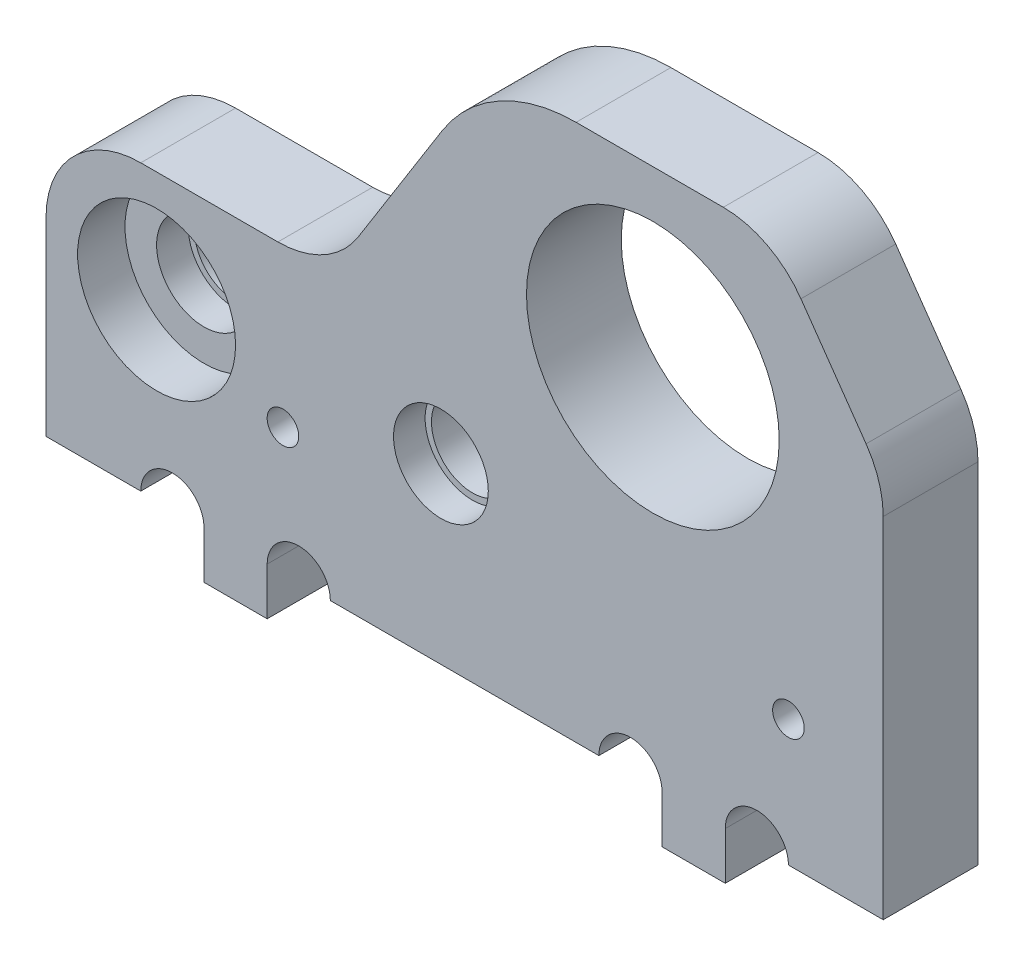
ISO-10303-21;
HEADER;
FILE_DESCRIPTION(('STEP AP214'),'2;1');
FILE_NAME('part.step','',(''),(''),'','','');
FILE_SCHEMA(('AUTOMOTIVE_DESIGN { 1 0 10303 214 1 1 1 1 }'));
ENDSEC;
DATA;
#1=APPLICATION_CONTEXT('core data for automotive mechanical design processes');
#2=APPLICATION_PROTOCOL_DEFINITION('international standard','automotive_design',2000,#1);
#3=PRODUCT_CONTEXT('',#1,'mechanical');
#4=PRODUCT('Part','Part','',(#3));
#5=PRODUCT_RELATED_PRODUCT_CATEGORY('part','',(#4));
#6=PRODUCT_DEFINITION_FORMATION('','',#4);
#7=PRODUCT_DEFINITION_CONTEXT('part definition',#1,'design');
#8=PRODUCT_DEFINITION('design','',#6,#7);
#9=PRODUCT_DEFINITION_SHAPE('','',#8);
#10=(LENGTH_UNIT() NAMED_UNIT(*) SI_UNIT(.MILLI.,.METRE.));
#11=(NAMED_UNIT(*) PLANE_ANGLE_UNIT() SI_UNIT($,.RADIAN.));
#12=(NAMED_UNIT(*) SI_UNIT($,.STERADIAN.) SOLID_ANGLE_UNIT());
#13=UNCERTAINTY_MEASURE_WITH_UNIT(LENGTH_MEASURE(1.E-05),#10,'distance_accuracy_value','');
#14=(GEOMETRIC_REPRESENTATION_CONTEXT(3) GLOBAL_UNCERTAINTY_ASSIGNED_CONTEXT((#13)) GLOBAL_UNIT_ASSIGNED_CONTEXT((#10,
#11,#12)) REPRESENTATION_CONTEXT('',''));
#15=CARTESIAN_POINT('',(0.,0.,0.));
#16=DIRECTION('',(0.,0.,1.));
#17=DIRECTION('',(1.,0.,0.));
#18=AXIS2_PLACEMENT_3D('',#15,#16,#17);
#19=CARTESIAN_POINT('',(0.,0.,0.));
#20=DIRECTION('',(0.,-1.,0.));
#21=DIRECTION('',(0.,0.,-1.));
#22=AXIS2_PLACEMENT_3D('',#19,#20,#21);
#23=PLANE('',#22);
#24=DIRECTION('',(-1.,0.,0.));
#25=VECTOR('',#24,1.);
#26=CARTESIAN_POINT('',(0.,0.,-3.));
#27=LINE('',#26,#25);
#28=CARTESIAN_POINT('',(17.5,0.,-3.));
#29=VERTEX_POINT('',#28);
#30=CARTESIAN_POINT('',(9.,0.,-3.));
#31=VERTEX_POINT('',#30);
#32=EDGE_CURVE('E311',#29,#31,#27,.T.);
#33=ORIENTED_EDGE('',*,*,#32,.F.);
#34=DIRECTION('',(0.,0.,-1.));
#35=VECTOR('',#34,1.);
#36=CARTESIAN_POINT('',(17.5,0.,0.));
#37=LINE('',#36,#35);
#38=CARTESIAN_POINT('',(17.5,0.,0.));
#39=VERTEX_POINT('',#38);
#40=EDGE_CURVE('E355',#39,#29,#37,.T.);
#41=ORIENTED_EDGE('',*,*,#40,.F.);
#42=DIRECTION('',(1.,0.,0.));
#43=VECTOR('',#42,1.);
#44=CARTESIAN_POINT('',(0.,0.,0.));
#45=LINE('',#44,#43);
#46=CARTESIAN_POINT('',(9.,0.,0.));
#47=VERTEX_POINT('',#46);
#48=EDGE_CURVE('E224',#47,#39,#45,.T.);
#49=ORIENTED_EDGE('',*,*,#48,.F.);
#50=DIRECTION('',(0.,0.,-1.));
#51=VECTOR('',#50,1.);
#52=CARTESIAN_POINT('',(9.,0.,0.));
#53=LINE('',#52,#51);
#54=EDGE_CURVE('E358',#31,#47,#53,.F.);
#55=ORIENTED_EDGE('',*,*,#54,.F.);
#56=EDGE_LOOP('',(#33,#41,#49,#55));
#57=FACE_BOUND('',#56,.T.);
#58=ADVANCED_FACE('F33',(#57),#23,.T.);
#59=DIRECTION('',(-1.,0.,0.));
#60=VECTOR('',#59,1.);
#61=CARTESIAN_POINT('',(0.,0.,-3.));
#62=LINE('',#61,#60);
#63=CARTESIAN_POINT('',(26.5,0.,-3.));
#64=VERTEX_POINT('',#63);
#65=CARTESIAN_POINT('',(23.5,0.,-3.));
#66=VERTEX_POINT('',#65);
#67=EDGE_CURVE('E197',#64,#66,#62,.T.);
#68=ORIENTED_EDGE('',*,*,#67,.F.);
#69=DIRECTION('',(0.,0.,-1.));
#70=VECTOR('',#69,1.);
#71=CARTESIAN_POINT('',(26.5,0.,0.));
#72=LINE('',#71,#70);
#73=CARTESIAN_POINT('',(26.5,0.,0.));
#74=VERTEX_POINT('',#73);
#75=EDGE_CURVE('E210',#74,#64,#72,.T.);
#76=ORIENTED_EDGE('',*,*,#75,.F.);
#77=CARTESIAN_POINT('',(23.5,0.,0.));
#78=VERTEX_POINT('',#77);
#79=EDGE_CURVE('E226',#78,#74,#45,.T.);
#80=ORIENTED_EDGE('',*,*,#79,.F.);
#81=DIRECTION('',(0.,0.,-1.));
#82=VECTOR('',#81,1.);
#83=CARTESIAN_POINT('',(23.5,0.,0.));
#84=LINE('',#83,#82);
#85=EDGE_CURVE('E211',#66,#78,#84,.F.);
#86=ORIENTED_EDGE('',*,*,#85,.F.);
#87=EDGE_LOOP('',(#68,#76,#80,#86));
#88=FACE_BOUND('',#87,.T.);
#89=ADVANCED_FACE('F208',(#88),#23,.T.);
#90=DIRECTION('',(-1.,0.,0.));
#91=VECTOR('',#90,1.);
#92=CARTESIAN_POINT('',(0.,0.,-3.));
#93=LINE('',#92,#91);
#94=CARTESIAN_POINT('',(3.,0.,-3.));
#95=VERTEX_POINT('',#94);
#96=CARTESIAN_POINT('',(0.,0.,-3.));
#97=VERTEX_POINT('',#96);
#98=EDGE_CURVE('E303',#95,#97,#93,.T.);
#99=ORIENTED_EDGE('',*,*,#98,.F.);
#100=DIRECTION('',(0.,0.,-1.));
#101=VECTOR('',#100,1.);
#102=CARTESIAN_POINT('',(3.,0.,0.));
#103=LINE('',#102,#101);
#104=CARTESIAN_POINT('',(3.,0.,0.));
#105=VERTEX_POINT('',#104);
#106=EDGE_CURVE('E360',#105,#95,#103,.T.);
#107=ORIENTED_EDGE('',*,*,#106,.F.);
#108=CARTESIAN_POINT('',(0.,0.,0.));
#109=VERTEX_POINT('',#108);
#110=EDGE_CURVE('E220',#109,#105,#45,.T.);
#111=ORIENTED_EDGE('',*,*,#110,.F.);
#112=DIRECTION('',(0.,0.,1.));
#113=VECTOR('',#112,1.);
#114=CARTESIAN_POINT('',(0.,0.,0.));
#115=LINE('',#114,#113);
#116=EDGE_CURVE('E424',#97,#109,#115,.T.);
#117=ORIENTED_EDGE('',*,*,#116,.F.);
#118=EDGE_LOOP('',(#99,#107,#111,#117));
#119=FACE_BOUND('',#118,.T.);
#120=ADVANCED_FACE('F492',(#119),#23,.T.);
#121=CARTESIAN_POINT('',(12.5,5.5,-6.));
#122=DIRECTION('',(0.,0.,1.));
#123=DIRECTION('',(1.,0.,0.));
#124=AXIS2_PLACEMENT_3D('',#121,#122,#123);
#125=CYLINDRICAL_SURFACE('',#124,1.3);
#126=CARTESIAN_POINT('',(12.5,5.5,-3.));
#127=DIRECTION('',(0.,0.,1.));
#128=DIRECTION('',(1.,0.,0.));
#129=AXIS2_PLACEMENT_3D('',#126,#127,#128);
#130=CIRCLE('',#129,1.3);
#131=CARTESIAN_POINT('',(13.8,5.5,-3.));
#132=VERTEX_POINT('',#131);
#133=EDGE_CURVE('E328',#132,#132,#130,.F.);
#134=ORIENTED_EDGE('',*,*,#133,.T.);
#135=EDGE_LOOP('',(#134));
#136=FACE_BOUND('',#135,.T.);
#137=CARTESIAN_POINT('',(12.5,5.5,-1.));
#138=DIRECTION('',(0.,0.,1.));
#139=DIRECTION('',(1.,0.,0.));
#140=AXIS2_PLACEMENT_3D('',#137,#138,#139);
#141=CIRCLE('',#140,1.3);
#142=CARTESIAN_POINT('',(13.8,5.5,-1.));
#143=VERTEX_POINT('',#142);
#144=EDGE_CURVE('E417',#143,#143,#141,.T.);
#145=ORIENTED_EDGE('',*,*,#144,.T.);
#146=EDGE_LOOP('',(#145));
#147=FACE_BOUND('',#146,.T.);
#148=ADVANCED_FACE('F500',(#136,#147),#125,.F.);
#149=CARTESIAN_POINT('',(3.5,5.5,-6.));
#150=DIRECTION('',(0.,0.,1.));
#151=DIRECTION('',(1.,0.,0.));
#152=AXIS2_PLACEMENT_3D('',#149,#150,#151);
#153=CYLINDRICAL_SURFACE('',#152,1.3);
#154=CARTESIAN_POINT('',(3.5,5.5,-3.));
#155=DIRECTION('',(0.,0.,1.));
#156=DIRECTION('',(1.,0.,0.));
#157=AXIS2_PLACEMENT_3D('',#154,#155,#156);
#158=CIRCLE('',#157,1.3);
#159=CARTESIAN_POINT('',(4.8,5.5,-3.));
#160=VERTEX_POINT('',#159);
#161=EDGE_CURVE('E325',#160,#160,#158,.F.);
#162=ORIENTED_EDGE('',*,*,#161,.T.);
#163=EDGE_LOOP('',(#162));
#164=FACE_BOUND('',#163,.T.);
#165=CARTESIAN_POINT('',(3.5,5.5,-2.5));
#166=DIRECTION('',(0.,0.,1.));
#167=DIRECTION('',(1.,0.,0.));
#168=AXIS2_PLACEMENT_3D('',#165,#166,#167);
#169=CIRCLE('',#168,1.3);
#170=CARTESIAN_POINT('',(4.8,5.5,-2.5));
#171=VERTEX_POINT('',#170);
#172=EDGE_CURVE('E399',#171,#171,#169,.T.);
#173=ORIENTED_EDGE('',*,*,#172,.T.);
#174=EDGE_LOOP('',(#173));
#175=FACE_BOUND('',#174,.T.);
#176=ADVANCED_FACE('F505',(#164,#175),#153,.F.);
#177=CARTESIAN_POINT('',(0.,17.,0.));
#178=DIRECTION('',(1.,0.,0.));
#179=DIRECTION('',(0.,0.,-1.));
#180=AXIS2_PLACEMENT_3D('',#177,#178,#179);
#181=PLANE('',#180);
#182=DIRECTION('',(0.,0.,-1.));
#183=VECTOR('',#182,1.);
#184=CARTESIAN_POINT('',(0.,6.,0.));
#185=LINE('',#184,#183);
#186=CARTESIAN_POINT('',(0.,6.,0.));
#187=VERTEX_POINT('',#186);
#188=CARTESIAN_POINT('',(0.,6.,-3.));
#189=VERTEX_POINT('',#188);
#190=EDGE_CURVE('E265',#187,#189,#185,.T.);
#191=ORIENTED_EDGE('',*,*,#190,.T.);
#192=DIRECTION('',(0.,1.,0.));
#193=VECTOR('',#192,1.);
#194=CARTESIAN_POINT('',(0.,-1.5,-3.));
#195=LINE('',#194,#193);
#196=EDGE_CURVE('E49',#97,#189,#195,.T.);
#197=ORIENTED_EDGE('',*,*,#196,.F.);
#198=ORIENTED_EDGE('',*,*,#116,.T.);
#199=DIRECTION('',(0.,-1.,0.));
#200=VECTOR('',#199,1.);
#201=CARTESIAN_POINT('',(0.,17.,0.));
#202=LINE('',#201,#200);
#203=EDGE_CURVE('E230',#187,#109,#202,.T.);
#204=ORIENTED_EDGE('',*,*,#203,.F.);
#205=EDGE_LOOP('',(#191,#197,#198,#204));
#206=FACE_BOUND('',#205,.T.);
#207=ADVANCED_FACE('F271',(#206),#181,.F.);
#208=CARTESIAN_POINT('',(0.,17.,0.));
#209=DIRECTION('',(0.,0.,-1.));
#210=DIRECTION('',(-1.,0.,0.));
#211=AXIS2_PLACEMENT_3D('',#208,#209,#210);
#212=PLANE('',#211);
#213=CARTESIAN_POINT('',(23.5,4.,0.));
#214=DIRECTION('',(0.,0.,-1.));
#215=DIRECTION('',(-1.,0.,0.));
#216=AXIS2_PLACEMENT_3D('',#213,#214,#215);
#217=CIRCLE('',#216,0.499999999999999);
#218=CARTESIAN_POINT('',(23.,4.,0.));
#219=VERTEX_POINT('',#218);
#220=EDGE_CURVE('E332',#219,#219,#217,.T.);
#221=ORIENTED_EDGE('',*,*,#220,.T.);
#222=EDGE_LOOP('',(#221));
#223=FACE_BOUND('',#222,.T.);
#224=CARTESIAN_POINT('',(7.5,4.,0.));
#225=DIRECTION('',(0.,0.,-1.));
#226=DIRECTION('',(-1.,0.,0.));
#227=AXIS2_PLACEMENT_3D('',#224,#225,#226);
#228=CIRCLE('',#227,0.500000000000001);
#229=CARTESIAN_POINT('',(7.,4.,0.));
#230=VERTEX_POINT('',#229);
#231=EDGE_CURVE('E331',#230,#230,#228,.T.);
#232=ORIENTED_EDGE('',*,*,#231,.T.);
#233=EDGE_LOOP('',(#232));
#234=FACE_BOUND('',#233,.T.);
#235=CARTESIAN_POINT('',(3.5,5.5,0.));
#236=DIRECTION('',(0.,0.,1.));
#237=DIRECTION('',(1.,0.,0.));
#238=AXIS2_PLACEMENT_3D('',#235,#236,#237);
#239=CIRCLE('',#238,2.5);
#240=CARTESIAN_POINT('',(6.,5.5,0.));
#241=VERTEX_POINT('',#240);
#242=EDGE_CURVE('E406',#241,#241,#239,.T.);
#243=ORIENTED_EDGE('',*,*,#242,.F.);
#244=EDGE_LOOP('',(#243));
#245=FACE_BOUND('',#244,.T.);
#246=CARTESIAN_POINT('',(19.2082039324994,11.5,0.));
#247=DIRECTION('',(0.,0.,1.));
#248=DIRECTION('',(1.,0.,0.));
#249=AXIS2_PLACEMENT_3D('',#246,#247,#248);
#250=CIRCLE('',#249,4.);
#251=CARTESIAN_POINT('',(23.2082039324994,11.5,0.));
#252=VERTEX_POINT('',#251);
#253=EDGE_CURVE('E412',#252,#252,#250,.T.);
#254=ORIENTED_EDGE('',*,*,#253,.F.);
#255=EDGE_LOOP('',(#254));
#256=FACE_BOUND('',#255,.T.);
#257=CARTESIAN_POINT('',(12.5,5.5,0.));
#258=DIRECTION('',(0.,0.,1.));
#259=DIRECTION('',(1.,0.,0.));
#260=AXIS2_PLACEMENT_3D('',#257,#258,#259);
#261=CIRCLE('',#260,1.5);
#262=CARTESIAN_POINT('',(14.,5.5,0.));
#263=VERTEX_POINT('',#262);
#264=EDGE_CURVE('E420',#263,#263,#261,.T.);
#265=ORIENTED_EDGE('',*,*,#264,.F.);
#266=EDGE_LOOP('',(#265));
#267=FACE_BOUND('',#266,.T.);
#268=DIRECTION('',(-1.,0.,0.));
#269=VECTOR('',#268,1.);
#270=CARTESIAN_POINT('',(0.,9.,0.));
#271=LINE('',#270,#269);
#272=CARTESIAN_POINT('',(7.33919631394635,9.,0.));
#273=VERTEX_POINT('',#272);
#274=CARTESIAN_POINT('',(3.,9.,0.));
#275=VERTEX_POINT('',#274);
#276=EDGE_CURVE('E340',#273,#275,#271,.T.);
#277=ORIENTED_EDGE('',*,*,#276,.T.);
#278=CARTESIAN_POINT('',(3.,6.,0.));
#279=DIRECTION('',(0.,0.,-1.));
#280=DIRECTION('',(-1.,0.,0.));
#281=AXIS2_PLACEMENT_3D('',#278,#279,#280);
#282=CIRCLE('',#281,3.);
#283=EDGE_CURVE('E11',#275,#187,#282,.F.);
#284=ORIENTED_EDGE('',*,*,#283,.T.);
#285=ORIENTED_EDGE('',*,*,#203,.T.);
#286=ORIENTED_EDGE('',*,*,#110,.T.);
#287=CARTESIAN_POINT('',(4.,0.,0.));
#288=DIRECTION('',(0.,0.,-1.));
#289=DIRECTION('',(-1.,0.,0.));
#290=AXIS2_PLACEMENT_3D('',#287,#288,#289);
#291=CIRCLE('',#290,1.);
#292=CARTESIAN_POINT('',(5.,0.,0.));
#293=VERTEX_POINT('',#292);
#294=EDGE_CURVE('E342',#105,#293,#291,.T.);
#295=ORIENTED_EDGE('',*,*,#294,.T.);
#296=DIRECTION('',(0.,1.,0.));
#297=VECTOR('',#296,1.);
#298=CARTESIAN_POINT('',(5.,-1.5,0.));
#299=LINE('',#298,#297);
#300=CARTESIAN_POINT('',(5.,-1.5,0.));
#301=VERTEX_POINT('',#300);
#302=EDGE_CURVE('E390',#301,#293,#299,.T.);
#303=ORIENTED_EDGE('',*,*,#302,.F.);
#304=DIRECTION('',(-1.,0.,0.));
#305=VECTOR('',#304,1.);
#306=CARTESIAN_POINT('',(5.,-1.5,0.));
#307=LINE('',#306,#305);
#308=CARTESIAN_POINT('',(7.,-1.5,0.));
#309=VERTEX_POINT('',#308);
#310=EDGE_CURVE('E388',#309,#301,#307,.T.);
#311=ORIENTED_EDGE('',*,*,#310,.F.);
#312=DIRECTION('',(0.,1.,0.));
#313=VECTOR('',#312,1.);
#314=CARTESIAN_POINT('',(7.,-1.5,0.));
#315=LINE('',#314,#313);
#316=CARTESIAN_POINT('',(7.,0.,0.));
#317=VERTEX_POINT('',#316);
#318=EDGE_CURVE('E396',#309,#317,#315,.T.);
#319=ORIENTED_EDGE('',*,*,#318,.T.);
#320=CARTESIAN_POINT('',(8.,0.,0.));
#321=DIRECTION('',(0.,0.,-1.));
#322=DIRECTION('',(-1.,0.,0.));
#323=AXIS2_PLACEMENT_3D('',#320,#321,#322);
#324=CIRCLE('',#323,1.);
#325=EDGE_CURVE('E349',#317,#47,#324,.T.);
#326=ORIENTED_EDGE('',*,*,#325,.T.);
#327=ORIENTED_EDGE('',*,*,#48,.T.);
#328=CARTESIAN_POINT('',(18.5,0.,0.));
#329=DIRECTION('',(0.,0.,-1.));
#330=DIRECTION('',(-1.,0.,0.));
#331=AXIS2_PLACEMENT_3D('',#328,#329,#330);
#332=CIRCLE('',#331,1.);
#333=CARTESIAN_POINT('',(19.5,0.,0.));
#334=VERTEX_POINT('',#333);
#335=EDGE_CURVE('E346',#39,#334,#332,.T.);
#336=ORIENTED_EDGE('',*,*,#335,.T.);
#337=DIRECTION('',(0.,1.,0.));
#338=VECTOR('',#337,1.);
#339=CARTESIAN_POINT('',(19.5,-1.5,0.));
#340=LINE('',#339,#338);
#341=CARTESIAN_POINT('',(19.5,-1.5,0.));
#342=VERTEX_POINT('',#341);
#343=EDGE_CURVE('E372',#342,#334,#340,.T.);
#344=ORIENTED_EDGE('',*,*,#343,.F.);
#345=DIRECTION('',(-1.,0.,0.));
#346=VECTOR('',#345,1.);
#347=CARTESIAN_POINT('',(19.5,-1.5,0.));
#348=LINE('',#347,#346);
#349=CARTESIAN_POINT('',(21.5,-1.5,0.));
#350=VERTEX_POINT('',#349);
#351=EDGE_CURVE('E370',#350,#342,#348,.T.);
#352=ORIENTED_EDGE('',*,*,#351,.F.);
#353=DIRECTION('',(0.,1.,0.));
#354=VECTOR('',#353,1.);
#355=CARTESIAN_POINT('',(21.5,-1.5,0.));
#356=LINE('',#355,#354);
#357=CARTESIAN_POINT('',(21.5,0.,0.));
#358=VERTEX_POINT('',#357);
#359=EDGE_CURVE('E378',#350,#358,#356,.T.);
#360=ORIENTED_EDGE('',*,*,#359,.T.);
#361=CARTESIAN_POINT('',(22.5,0.,0.));
#362=DIRECTION('',(0.,0.,-1.));
#363=DIRECTION('',(-1.,0.,0.));
#364=AXIS2_PLACEMENT_3D('',#361,#362,#363);
#365=CIRCLE('',#364,1.);
#366=EDGE_CURVE('E343',#358,#78,#365,.T.);
#367=ORIENTED_EDGE('',*,*,#366,.T.);
#368=ORIENTED_EDGE('',*,*,#79,.T.);
#369=DIRECTION('',(0.,-1.,0.));
#370=VECTOR('',#369,1.);
#371=CARTESIAN_POINT('',(26.5,17.,0.));
#372=LINE('',#371,#370);
#373=CARTESIAN_POINT('',(26.5,11.0543333075427,0.));
#374=VERTEX_POINT('',#373);
#375=EDGE_CURVE('E217',#374,#74,#372,.T.);
#376=ORIENTED_EDGE('',*,*,#375,.F.);
#377=CARTESIAN_POINT('',(23.5,11.0543333075427,0.));
#378=DIRECTION('',(0.,0.,-1.));
#379=DIRECTION('',(-1.,0.,0.));
#380=AXIS2_PLACEMENT_3D('',#377,#378,#379);
#381=CIRCLE('',#380,3.);
#382=CARTESIAN_POINT('',(25.9576957615571,12.7747203406327,0.));
#383=VERTEX_POINT('',#382);
#384=EDGE_CURVE('E241',#374,#383,#381,.F.);
#385=ORIENTED_EDGE('',*,*,#384,.T.);
#386=DIRECTION('',(0.573462344363328,-0.819231920519041,0.));
#387=VECTOR('',#386,1.);
#388=CARTESIAN_POINT('',(23.,17.,0.));
#389=LINE('',#388,#387);
#390=CARTESIAN_POINT('',(23.895729076837,15.72038703309,0.));
#391=VERTEX_POINT('',#390);
#392=EDGE_CURVE('E233',#383,#391,#389,.F.);
#393=ORIENTED_EDGE('',*,*,#392,.T.);
#394=CARTESIAN_POINT('',(21.4380333152799,14.,0.));
#395=DIRECTION('',(0.,0.,-1.));
#396=DIRECTION('',(-1.,0.,0.));
#397=AXIS2_PLACEMENT_3D('',#394,#395,#396);
#398=CIRCLE('',#397,3.);
#399=CARTESIAN_POINT('',(21.4380333152799,17.,0.));
#400=VERTEX_POINT('',#399);
#401=EDGE_CURVE('E238',#391,#400,#398,.F.);
#402=ORIENTED_EDGE('',*,*,#401,.T.);
#403=DIRECTION('',(1.,0.,0.));
#404=VECTOR('',#403,1.);
#405=CARTESIAN_POINT('',(0.,17.,0.));
#406=LINE('',#405,#404);
#407=CARTESIAN_POINT('',(16.779018718282,17.,0.));
#408=VERTEX_POINT('',#407);
#409=EDGE_CURVE('E219',#408,#400,#406,.T.);
#410=ORIENTED_EDGE('',*,*,#409,.F.);
#411=CARTESIAN_POINT('',(16.779018718282,12.,0.));
#412=DIRECTION('',(0.,0.,-1.));
#413=DIRECTION('',(-1.,0.,0.));
#414=AXIS2_PLACEMENT_3D('',#411,#412,#413);
#415=CIRCLE('',#414,5.);
#416=CARTESIAN_POINT('',(12.5416508646635,14.6541879498484,0.));
#417=VERTEX_POINT('',#416);
#418=EDGE_CURVE('E256',#408,#417,#415,.F.);
#419=ORIENTED_EDGE('',*,*,#418,.T.);
#420=DIRECTION('',(-0.530837589969674,-0.847473570723706,0.));
#421=VECTOR('',#420,1.);
#422=CARTESIAN_POINT('',(9.,9.,0.));
#423=LINE('',#422,#421);
#424=CARTESIAN_POINT('',(9.88161702611747,10.407487230091,0.));
#425=VERTEX_POINT('',#424);
#426=EDGE_CURVE('E335',#417,#425,#423,.T.);
#427=ORIENTED_EDGE('',*,*,#426,.T.);
#428=CARTESIAN_POINT('',(7.33919631394635,12.,0.));
#429=DIRECTION('',(0.,0.,-1.));
#430=DIRECTION('',(-1.,0.,0.));
#431=AXIS2_PLACEMENT_3D('',#428,#429,#430);
#432=CIRCLE('',#431,3.);
#433=EDGE_CURVE('E263',#425,#273,#432,.T.);
#434=ORIENTED_EDGE('',*,*,#433,.T.);
#435=EDGE_LOOP('',(#277,#284,#285,#286,#295,#303,#311,#319,#326,#327,#336,#344,#352,#360,#367,
#368,#376,#385,#393,#402,#410,#419,#427,#434));
#436=FACE_BOUND('',#435,.T.);
#437=ADVANCED_FACE('F429',(#223,#234,#245,#256,#267,#436),#212,.F.);
#438=CARTESIAN_POINT('',(26.5,17.,0.));
#439=DIRECTION('',(-1.,0.,0.));
#440=DIRECTION('',(0.,0.,1.));
#441=AXIS2_PLACEMENT_3D('',#438,#439,#440);
#442=PLANE('',#441);
#443=ORIENTED_EDGE('',*,*,#75,.T.);
#444=DIRECTION('',(0.,1.,0.));
#445=VECTOR('',#444,1.);
#446=CARTESIAN_POINT('',(26.5,-1.5,-3.));
#447=LINE('',#446,#445);
#448=CARTESIAN_POINT('',(26.5,11.0543333075427,-3.));
#449=VERTEX_POINT('',#448);
#450=EDGE_CURVE('E193',#64,#449,#447,.T.);
#451=ORIENTED_EDGE('',*,*,#450,.T.);
#452=DIRECTION('',(0.,0.,-1.));
#453=VECTOR('',#452,1.);
#454=CARTESIAN_POINT('',(26.5,11.0543333075427,0.));
#455=LINE('',#454,#453);
#456=EDGE_CURVE('E236',#449,#374,#455,.F.);
#457=ORIENTED_EDGE('',*,*,#456,.T.);
#458=ORIENTED_EDGE('',*,*,#375,.T.);
#459=EDGE_LOOP('',(#443,#451,#457,#458));
#460=FACE_BOUND('',#459,.T.);
#461=ADVANCED_FACE('F215',(#460),#442,.F.);
#462=CARTESIAN_POINT('',(0.,17.,0.));
#463=DIRECTION('',(0.,-1.,0.));
#464=DIRECTION('',(0.,0.,-1.));
#465=AXIS2_PLACEMENT_3D('',#462,#463,#464);
#466=PLANE('',#465);
#467=DIRECTION('',(0.,0.,1.));
#468=VECTOR('',#467,1.);
#469=CARTESIAN_POINT('',(21.4380333152799,17.,-6.));
#470=LINE('',#469,#468);
#471=CARTESIAN_POINT('',(21.4380333152799,17.,-3.));
#472=VERTEX_POINT('',#471);
#473=EDGE_CURVE('E248',#400,#472,#470,.F.);
#474=ORIENTED_EDGE('',*,*,#473,.T.);
#475=DIRECTION('',(1.,0.,0.));
#476=VECTOR('',#475,1.);
#477=CARTESIAN_POINT('',(26.5,17.,-3.));
#478=LINE('',#477,#476);
#479=CARTESIAN_POINT('',(16.779018718282,17.,-3.));
#480=VERTEX_POINT('',#479);
#481=EDGE_CURVE('E455',#480,#472,#478,.T.);
#482=ORIENTED_EDGE('',*,*,#481,.F.);
#483=DIRECTION('',(0.,0.,-1.));
#484=VECTOR('',#483,1.);
#485=CARTESIAN_POINT('',(16.779018718282,17.,0.));
#486=LINE('',#485,#484);
#487=EDGE_CURVE('E254',#480,#408,#486,.F.);
#488=ORIENTED_EDGE('',*,*,#487,.T.);
#489=ORIENTED_EDGE('',*,*,#409,.T.);
#490=EDGE_LOOP('',(#474,#482,#488,#489));
#491=FACE_BOUND('',#490,.T.);
#492=ADVANCED_FACE('F470',(#491),#466,.F.);
#493=CARTESIAN_POINT('',(12.5,5.5,-1.));
#494=DIRECTION('',(0.,0.,1.));
#495=DIRECTION('',(1.,0.,0.));
#496=AXIS2_PLACEMENT_3D('',#493,#494,#495);
#497=CYLINDRICAL_SURFACE('',#496,1.5);
#498=CARTESIAN_POINT('',(12.5,5.5,-1.));
#499=DIRECTION('',(0.,0.,1.));
#500=DIRECTION('',(1.,0.,0.));
#501=AXIS2_PLACEMENT_3D('',#498,#499,#500);
#502=CIRCLE('',#501,1.5);
#503=CARTESIAN_POINT('',(14.,5.5,-1.));
#504=VERTEX_POINT('',#503);
#505=EDGE_CURVE('E421',#504,#504,#502,.T.);
#506=ORIENTED_EDGE('',*,*,#505,.F.);
#507=EDGE_LOOP('',(#506));
#508=FACE_BOUND('',#507,.T.);
#509=ORIENTED_EDGE('',*,*,#264,.T.);
#510=EDGE_LOOP('',(#509));
#511=FACE_BOUND('',#510,.T.);
#512=ADVANCED_FACE('F574',(#508,#511),#497,.F.);
#513=CARTESIAN_POINT('',(12.5,5.5,-1.));
#514=DIRECTION('',(0.,0.,1.));
#515=DIRECTION('',(1.,0.,0.));
#516=AXIS2_PLACEMENT_3D('',#513,#514,#515);
#517=PLANE('',#516);
#518=ORIENTED_EDGE('',*,*,#144,.F.);
#519=EDGE_LOOP('',(#518));
#520=FACE_BOUND('',#519,.T.);
#521=ORIENTED_EDGE('',*,*,#505,.T.);
#522=EDGE_LOOP('',(#521));
#523=FACE_BOUND('',#522,.T.);
#524=ADVANCED_FACE('F569',(#520,#523),#517,.T.);
#525=CARTESIAN_POINT('',(19.2082039324994,11.5,-6.));
#526=DIRECTION('',(0.,0.,1.));
#527=DIRECTION('',(1.,0.,0.));
#528=AXIS2_PLACEMENT_3D('',#525,#526,#527);
#529=CYLINDRICAL_SURFACE('',#528,4.);
#530=CARTESIAN_POINT('',(19.2082039324994,11.5,-3.));
#531=DIRECTION('',(0.,0.,1.));
#532=DIRECTION('',(1.,0.,0.));
#533=AXIS2_PLACEMENT_3D('',#530,#531,#532);
#534=CIRCLE('',#533,4.);
#535=CARTESIAN_POINT('',(23.2082039324994,11.5,-3.));
#536=VERTEX_POINT('',#535);
#537=EDGE_CURVE('E212',#536,#536,#534,.F.);
#538=ORIENTED_EDGE('',*,*,#537,.T.);
#539=EDGE_LOOP('',(#538));
#540=FACE_BOUND('',#539,.T.);
#541=ORIENTED_EDGE('',*,*,#253,.T.);
#542=EDGE_LOOP('',(#541));
#543=FACE_BOUND('',#542,.T.);
#544=ADVANCED_FACE('F566',(#540,#543),#529,.F.);
#545=CARTESIAN_POINT('',(3.5,5.5,-1.5));
#546=DIRECTION('',(0.,0.,1.));
#547=DIRECTION('',(1.,0.,0.));
#548=AXIS2_PLACEMENT_3D('',#545,#546,#547);
#549=CYLINDRICAL_SURFACE('',#548,2.5);
#550=CARTESIAN_POINT('',(3.5,5.5,-1.5));
#551=DIRECTION('',(0.,0.,1.));
#552=DIRECTION('',(1.,0.,0.));
#553=AXIS2_PLACEMENT_3D('',#550,#551,#552);
#554=CIRCLE('',#553,2.5);
#555=CARTESIAN_POINT('',(6.,5.5,-1.5));
#556=VERTEX_POINT('',#555);
#557=EDGE_CURVE('E409',#556,#556,#554,.T.);
#558=ORIENTED_EDGE('',*,*,#557,.F.);
#559=EDGE_LOOP('',(#558));
#560=FACE_BOUND('',#559,.T.);
#561=ORIENTED_EDGE('',*,*,#242,.T.);
#562=EDGE_LOOP('',(#561));
#563=FACE_BOUND('',#562,.T.);
#564=ADVANCED_FACE('F562',(#560,#563),#549,.F.);
#565=CARTESIAN_POINT('',(3.5,5.5,-1.5));
#566=DIRECTION('',(0.,0.,1.));
#567=DIRECTION('',(1.,0.,0.));
#568=AXIS2_PLACEMENT_3D('',#565,#566,#567);
#569=PLANE('',#568);
#570=CARTESIAN_POINT('',(3.5,5.5,-1.5));
#571=DIRECTION('',(0.,0.,1.));
#572=DIRECTION('',(1.,0.,0.));
#573=AXIS2_PLACEMENT_3D('',#570,#571,#572);
#574=CIRCLE('',#573,1.5);
#575=CARTESIAN_POINT('',(5.,5.5,-1.5));
#576=VERTEX_POINT('',#575);
#577=EDGE_CURVE('E402',#576,#576,#574,.T.);
#578=ORIENTED_EDGE('',*,*,#577,.F.);
#579=EDGE_LOOP('',(#578));
#580=FACE_BOUND('',#579,.T.);
#581=ORIENTED_EDGE('',*,*,#557,.T.);
#582=EDGE_LOOP('',(#581));
#583=FACE_BOUND('',#582,.T.);
#584=ADVANCED_FACE('F558',(#580,#583),#569,.T.);
#585=CARTESIAN_POINT('',(3.5,5.5,-2.5));
#586=DIRECTION('',(0.,0.,1.));
#587=DIRECTION('',(1.,0.,0.));
#588=AXIS2_PLACEMENT_3D('',#585,#586,#587);
#589=CYLINDRICAL_SURFACE('',#588,1.5);
#590=CARTESIAN_POINT('',(3.5,5.5,-2.5));
#591=DIRECTION('',(0.,0.,1.));
#592=DIRECTION('',(1.,0.,0.));
#593=AXIS2_PLACEMENT_3D('',#590,#591,#592);
#594=CIRCLE('',#593,1.5);
#595=CARTESIAN_POINT('',(5.,5.5,-2.5));
#596=VERTEX_POINT('',#595);
#597=EDGE_CURVE('E403',#596,#596,#594,.T.);
#598=ORIENTED_EDGE('',*,*,#597,.F.);
#599=EDGE_LOOP('',(#598));
#600=FACE_BOUND('',#599,.T.);
#601=ORIENTED_EDGE('',*,*,#577,.T.);
#602=EDGE_LOOP('',(#601));
#603=FACE_BOUND('',#602,.T.);
#604=ADVANCED_FACE('F554',(#600,#603),#589,.F.);
#605=CARTESIAN_POINT('',(3.5,5.5,-2.5));
#606=DIRECTION('',(0.,0.,1.));
#607=DIRECTION('',(1.,0.,0.));
#608=AXIS2_PLACEMENT_3D('',#605,#606,#607);
#609=PLANE('',#608);
#610=ORIENTED_EDGE('',*,*,#172,.F.);
#611=EDGE_LOOP('',(#610));
#612=FACE_BOUND('',#611,.T.);
#613=ORIENTED_EDGE('',*,*,#597,.T.);
#614=EDGE_LOOP('',(#613));
#615=FACE_BOUND('',#614,.T.);
#616=ADVANCED_FACE('F548',(#612,#615),#609,.T.);
#617=CARTESIAN_POINT('',(5.,-1.5,0.));
#618=DIRECTION('',(1.,0.,0.));
#619=DIRECTION('',(0.,0.,-1.));
#620=AXIS2_PLACEMENT_3D('',#617,#618,#619);
#621=PLANE('',#620);
#622=DIRECTION('',(0.,0.,-1.));
#623=VECTOR('',#622,1.);
#624=CARTESIAN_POINT('',(5.,0.,0.));
#625=LINE('',#624,#623);
#626=CARTESIAN_POINT('',(5.,0.,-3.));
#627=VERTEX_POINT('',#626);
#628=EDGE_CURVE('E381',#293,#627,#625,.T.);
#629=ORIENTED_EDGE('',*,*,#628,.T.);
#630=DIRECTION('',(0.,-1.,0.));
#631=VECTOR('',#630,1.);
#632=CARTESIAN_POINT('',(5.,-1.5,-3.));
#633=LINE('',#632,#631);
#634=CARTESIAN_POINT('',(5.,-1.5,-3.));
#635=VERTEX_POINT('',#634);
#636=EDGE_CURVE('E300',#627,#635,#633,.T.);
#637=ORIENTED_EDGE('',*,*,#636,.T.);
#638=DIRECTION('',(0.,0.,-1.));
#639=VECTOR('',#638,1.);
#640=CARTESIAN_POINT('',(5.,-1.5,0.));
#641=LINE('',#640,#639);
#642=EDGE_CURVE('E382',#301,#635,#641,.T.);
#643=ORIENTED_EDGE('',*,*,#642,.F.);
#644=ORIENTED_EDGE('',*,*,#302,.T.);
#645=EDGE_LOOP('',(#629,#637,#643,#644));
#646=FACE_BOUND('',#645,.T.);
#647=ADVANCED_FACE('F516',(#646),#621,.F.);
#648=CARTESIAN_POINT('',(7.,-1.5,0.));
#649=DIRECTION('',(-1.,0.,0.));
#650=DIRECTION('',(0.,0.,1.));
#651=AXIS2_PLACEMENT_3D('',#648,#649,#650);
#652=PLANE('',#651);
#653=DIRECTION('',(0.,0.,1.));
#654=VECTOR('',#653,1.);
#655=CARTESIAN_POINT('',(7.,-1.5,0.));
#656=LINE('',#655,#654);
#657=CARTESIAN_POINT('',(7.,-1.5,-3.));
#658=VERTEX_POINT('',#657);
#659=EDGE_CURVE('E385',#658,#309,#656,.T.);
#660=ORIENTED_EDGE('',*,*,#659,.F.);
#661=DIRECTION('',(0.,1.,0.));
#662=VECTOR('',#661,1.);
#663=CARTESIAN_POINT('',(7.,-1.5,-3.));
#664=LINE('',#663,#662);
#665=CARTESIAN_POINT('',(7.,0.,-3.));
#666=VERTEX_POINT('',#665);
#667=EDGE_CURVE('E308',#658,#666,#664,.T.);
#668=ORIENTED_EDGE('',*,*,#667,.T.);
#669=DIRECTION('',(0.,0.,1.));
#670=VECTOR('',#669,1.);
#671=CARTESIAN_POINT('',(7.,0.,0.));
#672=LINE('',#671,#670);
#673=EDGE_CURVE('E386',#666,#317,#672,.T.);
#674=ORIENTED_EDGE('',*,*,#673,.T.);
#675=ORIENTED_EDGE('',*,*,#318,.F.);
#676=EDGE_LOOP('',(#660,#668,#674,#675));
#677=FACE_BOUND('',#676,.T.);
#678=ADVANCED_FACE('F522',(#677),#652,.F.);
#679=CARTESIAN_POINT('',(0.,-1.5,0.));
#680=DIRECTION('',(0.,-1.,0.));
#681=DIRECTION('',(0.,0.,-1.));
#682=AXIS2_PLACEMENT_3D('',#679,#680,#681);
#683=PLANE('',#682);
#684=DIRECTION('',(1.,0.,0.));
#685=VECTOR('',#684,1.);
#686=CARTESIAN_POINT('',(26.5,-1.5,-3.));
#687=LINE('',#686,#685);
#688=EDGE_CURVE('E454',#635,#658,#687,.T.);
#689=ORIENTED_EDGE('',*,*,#688,.T.);
#690=ORIENTED_EDGE('',*,*,#659,.T.);
#691=ORIENTED_EDGE('',*,*,#310,.T.);
#692=ORIENTED_EDGE('',*,*,#642,.T.);
#693=EDGE_LOOP('',(#689,#690,#691,#692));
#694=FACE_BOUND('',#693,.T.);
#695=ADVANCED_FACE('F518',(#694),#683,.T.);
#696=CARTESIAN_POINT('',(19.5,-1.5,0.));
#697=DIRECTION('',(1.,0.,0.));
#698=DIRECTION('',(0.,0.,-1.));
#699=AXIS2_PLACEMENT_3D('',#696,#697,#698);
#700=PLANE('',#699);
#701=DIRECTION('',(0.,0.,-1.));
#702=VECTOR('',#701,1.);
#703=CARTESIAN_POINT('',(19.5,0.,0.));
#704=LINE('',#703,#702);
#705=CARTESIAN_POINT('',(19.5,0.,-3.));
#706=VERTEX_POINT('',#705);
#707=EDGE_CURVE('E363',#334,#706,#704,.T.);
#708=ORIENTED_EDGE('',*,*,#707,.T.);
#709=DIRECTION('',(0.,-1.,0.));
#710=VECTOR('',#709,1.);
#711=CARTESIAN_POINT('',(19.5,-1.5,-3.));
#712=LINE('',#711,#710);
#713=CARTESIAN_POINT('',(19.5,-1.5,-3.));
#714=VERTEX_POINT('',#713);
#715=EDGE_CURVE('E316',#706,#714,#712,.T.);
#716=ORIENTED_EDGE('',*,*,#715,.T.);
#717=DIRECTION('',(0.,0.,-1.));
#718=VECTOR('',#717,1.);
#719=CARTESIAN_POINT('',(19.5,-1.5,0.));
#720=LINE('',#719,#718);
#721=EDGE_CURVE('E364',#342,#714,#720,.T.);
#722=ORIENTED_EDGE('',*,*,#721,.F.);
#723=ORIENTED_EDGE('',*,*,#343,.T.);
#724=EDGE_LOOP('',(#708,#716,#722,#723));
#725=FACE_BOUND('',#724,.T.);
#726=ADVANCED_FACE('F439',(#725),#700,.F.);
#727=CARTESIAN_POINT('',(21.5,-1.5,0.));
#728=DIRECTION('',(-1.,0.,0.));
#729=DIRECTION('',(0.,0.,1.));
#730=AXIS2_PLACEMENT_3D('',#727,#728,#729);
#731=PLANE('',#730);
#732=DIRECTION('',(0.,0.,1.));
#733=VECTOR('',#732,1.);
#734=CARTESIAN_POINT('',(21.5,-1.5,0.));
#735=LINE('',#734,#733);
#736=CARTESIAN_POINT('',(21.5,-1.5,-3.));
#737=VERTEX_POINT('',#736);
#738=EDGE_CURVE('E367',#737,#350,#735,.T.);
#739=ORIENTED_EDGE('',*,*,#738,.F.);
#740=DIRECTION('',(0.,1.,0.));
#741=VECTOR('',#740,1.);
#742=CARTESIAN_POINT('',(21.5,-1.5,-3.));
#743=LINE('',#742,#741);
#744=CARTESIAN_POINT('',(21.5,0.,-3.));
#745=VERTEX_POINT('',#744);
#746=EDGE_CURVE('E213',#737,#745,#743,.T.);
#747=ORIENTED_EDGE('',*,*,#746,.T.);
#748=DIRECTION('',(0.,0.,1.));
#749=VECTOR('',#748,1.);
#750=CARTESIAN_POINT('',(21.5,0.,0.));
#751=LINE('',#750,#749);
#752=EDGE_CURVE('E368',#745,#358,#751,.T.);
#753=ORIENTED_EDGE('',*,*,#752,.T.);
#754=ORIENTED_EDGE('',*,*,#359,.F.);
#755=EDGE_LOOP('',(#739,#747,#753,#754));
#756=FACE_BOUND('',#755,.T.);
#757=ADVANCED_FACE('F449',(#756),#731,.F.);
#758=CARTESIAN_POINT('',(0.,-1.5,0.));
#759=DIRECTION('',(0.,-1.,0.));
#760=DIRECTION('',(0.,0.,-1.));
#761=AXIS2_PLACEMENT_3D('',#758,#759,#760);
#762=PLANE('',#761);
#763=EDGE_CURVE('E447',#714,#737,#687,.T.);
#764=ORIENTED_EDGE('',*,*,#763,.T.);
#765=ORIENTED_EDGE('',*,*,#738,.T.);
#766=ORIENTED_EDGE('',*,*,#351,.T.);
#767=ORIENTED_EDGE('',*,*,#721,.T.);
#768=EDGE_LOOP('',(#764,#765,#766,#767));
#769=FACE_BOUND('',#768,.T.);
#770=ADVANCED_FACE('F445',(#769),#762,.T.);
#771=CARTESIAN_POINT('',(22.5,0.,0.));
#772=DIRECTION('',(0.,0.,-1.));
#773=DIRECTION('',(-1.,0.,0.));
#774=AXIS2_PLACEMENT_3D('',#771,#772,#773);
#775=CYLINDRICAL_SURFACE('',#774,1.);
#776=ORIENTED_EDGE('',*,*,#752,.F.);
#777=CARTESIAN_POINT('',(22.5,0.,-3.));
#778=DIRECTION('',(0.,0.,1.));
#779=DIRECTION('',(1.,0.,0.));
#780=AXIS2_PLACEMENT_3D('',#777,#778,#779);
#781=CIRCLE('',#780,1.);
#782=EDGE_CURVE('E319',#745,#66,#781,.F.);
#783=ORIENTED_EDGE('',*,*,#782,.T.);
#784=ORIENTED_EDGE('',*,*,#85,.T.);
#785=ORIENTED_EDGE('',*,*,#366,.F.);
#786=EDGE_LOOP('',(#776,#783,#784,#785));
#787=FACE_BOUND('',#786,.T.);
#788=ADVANCED_FACE('F453',(#787),#775,.F.);
#789=CARTESIAN_POINT('',(18.5,0.,0.));
#790=DIRECTION('',(0.,0.,-1.));
#791=DIRECTION('',(-1.,0.,0.));
#792=AXIS2_PLACEMENT_3D('',#789,#790,#791);
#793=CYLINDRICAL_SURFACE('',#792,1.);
#794=ORIENTED_EDGE('',*,*,#40,.T.);
#795=CARTESIAN_POINT('',(18.5,0.,-3.));
#796=DIRECTION('',(0.,0.,1.));
#797=DIRECTION('',(1.,0.,0.));
#798=AXIS2_PLACEMENT_3D('',#795,#796,#797);
#799=CIRCLE('',#798,1.);
#800=EDGE_CURVE('E313',#29,#706,#799,.F.);
#801=ORIENTED_EDGE('',*,*,#800,.T.);
#802=ORIENTED_EDGE('',*,*,#707,.F.);
#803=ORIENTED_EDGE('',*,*,#335,.F.);
#804=EDGE_LOOP('',(#794,#801,#802,#803));
#805=FACE_BOUND('',#804,.T.);
#806=ADVANCED_FACE('F437',(#805),#793,.F.);
#807=CARTESIAN_POINT('',(8.,0.,0.));
#808=DIRECTION('',(0.,0.,-1.));
#809=DIRECTION('',(-1.,0.,0.));
#810=AXIS2_PLACEMENT_3D('',#807,#808,#809);
#811=CYLINDRICAL_SURFACE('',#810,1.);
#812=ORIENTED_EDGE('',*,*,#673,.F.);
#813=CARTESIAN_POINT('',(8.,0.,-3.));
#814=DIRECTION('',(0.,0.,1.));
#815=DIRECTION('',(1.,0.,0.));
#816=AXIS2_PLACEMENT_3D('',#813,#814,#815);
#817=CIRCLE('',#816,1.);
#818=EDGE_CURVE('E305',#666,#31,#817,.F.);
#819=ORIENTED_EDGE('',*,*,#818,.T.);
#820=ORIENTED_EDGE('',*,*,#54,.T.);
#821=ORIENTED_EDGE('',*,*,#325,.F.);
#822=EDGE_LOOP('',(#812,#819,#820,#821));
#823=FACE_BOUND('',#822,.T.);
#824=ADVANCED_FACE('F525',(#823),#811,.F.);
#825=CARTESIAN_POINT('',(4.,0.,0.));
#826=DIRECTION('',(0.,0.,-1.));
#827=DIRECTION('',(-1.,0.,0.));
#828=AXIS2_PLACEMENT_3D('',#825,#826,#827);
#829=CYLINDRICAL_SURFACE('',#828,1.);
#830=ORIENTED_EDGE('',*,*,#106,.T.);
#831=CARTESIAN_POINT('',(4.,0.,-3.));
#832=DIRECTION('',(0.,0.,1.));
#833=DIRECTION('',(1.,0.,0.));
#834=AXIS2_PLACEMENT_3D('',#831,#832,#833);
#835=CIRCLE('',#834,1.);
#836=EDGE_CURVE('E297',#95,#627,#835,.F.);
#837=ORIENTED_EDGE('',*,*,#836,.T.);
#838=ORIENTED_EDGE('',*,*,#628,.F.);
#839=ORIENTED_EDGE('',*,*,#294,.F.);
#840=EDGE_LOOP('',(#830,#837,#838,#839));
#841=FACE_BOUND('',#840,.T.);
#842=ADVANCED_FACE('F488',(#841),#829,.F.);
#843=CARTESIAN_POINT('',(23.,17.,0.));
#844=DIRECTION('',(-0.819231920519041,-0.573462344363328,0.));
#845=DIRECTION('',(0.,0.,-1.));
#846=AXIS2_PLACEMENT_3D('',#843,#844,#845);
#847=PLANE('',#846);
#848=DIRECTION('',(-0.573462344363328,0.819231920519041,0.));
#849=VECTOR('',#848,1.);
#850=CARTESIAN_POINT('',(23.,17.,-3.));
#851=LINE('',#850,#849);
#852=CARTESIAN_POINT('',(23.895729076837,15.72038703309,-3.));
#853=VERTEX_POINT('',#852);
#854=CARTESIAN_POINT('',(25.9576957615571,12.7747203406327,-3.));
#855=VERTEX_POINT('',#854);
#856=EDGE_CURVE('E294',#853,#855,#851,.F.);
#857=ORIENTED_EDGE('',*,*,#856,.F.);
#858=DIRECTION('',(0.,0.,-1.));
#859=VECTOR('',#858,1.);
#860=CARTESIAN_POINT('',(23.895729076837,15.72038703309,0.));
#861=LINE('',#860,#859);
#862=EDGE_CURVE('E243',#853,#391,#861,.F.);
#863=ORIENTED_EDGE('',*,*,#862,.T.);
#864=ORIENTED_EDGE('',*,*,#392,.F.);
#865=DIRECTION('',(0.,0.,1.));
#866=VECTOR('',#865,1.);
#867=CARTESIAN_POINT('',(25.9576957615571,12.7747203406327,-6.));
#868=LINE('',#867,#866);
#869=EDGE_CURVE('E245',#383,#855,#868,.F.);
#870=ORIENTED_EDGE('',*,*,#869,.T.);
#871=EDGE_LOOP('',(#857,#863,#864,#870));
#872=FACE_BOUND('',#871,.T.);
#873=ADVANCED_FACE('F477',(#872),#847,.F.);
#874=CARTESIAN_POINT('',(23.5,11.0543333075427,0.));
#875=DIRECTION('',(0.,0.,1.));
#876=DIRECTION('',(1.,0.,0.));
#877=AXIS2_PLACEMENT_3D('',#874,#875,#876);
#878=CYLINDRICAL_SURFACE('',#877,3.);
#879=CARTESIAN_POINT('',(23.5,11.0543333075427,-3.));
#880=DIRECTION('',(0.,0.,1.));
#881=DIRECTION('',(1.,0.,0.));
#882=AXIS2_PLACEMENT_3D('',#879,#880,#881);
#883=CIRCLE('',#882,3.);
#884=EDGE_CURVE('E200',#855,#449,#883,.F.);
#885=ORIENTED_EDGE('',*,*,#884,.F.);
#886=ORIENTED_EDGE('',*,*,#869,.F.);
#887=ORIENTED_EDGE('',*,*,#384,.F.);
#888=ORIENTED_EDGE('',*,*,#456,.F.);
#889=EDGE_LOOP('',(#885,#886,#887,#888));
#890=FACE_BOUND('',#889,.T.);
#891=ADVANCED_FACE('F479',(#890),#878,.T.);
#892=CARTESIAN_POINT('',(21.4380333152799,14.,0.));
#893=DIRECTION('',(0.,0.,-1.));
#894=DIRECTION('',(-1.,0.,0.));
#895=AXIS2_PLACEMENT_3D('',#892,#893,#894);
#896=CYLINDRICAL_SURFACE('',#895,3.);
#897=CARTESIAN_POINT('',(21.4380333152799,14.,-3.));
#898=DIRECTION('',(0.,0.,1.));
#899=DIRECTION('',(1.,0.,0.));
#900=AXIS2_PLACEMENT_3D('',#897,#898,#899);
#901=CIRCLE('',#900,3.);
#902=EDGE_CURVE('E292',#472,#853,#901,.F.);
#903=ORIENTED_EDGE('',*,*,#902,.F.);
#904=ORIENTED_EDGE('',*,*,#473,.F.);
#905=ORIENTED_EDGE('',*,*,#401,.F.);
#906=ORIENTED_EDGE('',*,*,#862,.F.);
#907=EDGE_LOOP('',(#903,#904,#905,#906));
#908=FACE_BOUND('',#907,.T.);
#909=ADVANCED_FACE('F468',(#908),#896,.T.);
#910=CARTESIAN_POINT('',(0.,9.,0.));
#911=DIRECTION('',(0.,-1.,0.));
#912=DIRECTION('',(1.,0.,0.));
#913=AXIS2_PLACEMENT_3D('',#910,#911,#912);
#914=PLANE('',#913);
#915=DIRECTION('',(0.,0.,-1.));
#916=VECTOR('',#915,1.);
#917=CARTESIAN_POINT('',(7.33919631394635,9.,-6.));
#918=LINE('',#917,#916);
#919=CARTESIAN_POINT('',(7.33919631394635,9.,-3.));
#920=VERTEX_POINT('',#919);
#921=EDGE_CURVE('E258',#273,#920,#918,.T.);
#922=ORIENTED_EDGE('',*,*,#921,.T.);
#923=DIRECTION('',(-1.,0.,0.));
#924=VECTOR('',#923,1.);
#925=CARTESIAN_POINT('',(0.,9.,-3.));
#926=LINE('',#925,#924);
#927=CARTESIAN_POINT('',(3.,9.,-3.));
#928=VERTEX_POINT('',#927);
#929=EDGE_CURVE('E276',#920,#928,#926,.T.);
#930=ORIENTED_EDGE('',*,*,#929,.T.);
#931=DIRECTION('',(0.,0.,-1.));
#932=VECTOR('',#931,1.);
#933=CARTESIAN_POINT('',(3.,9.,0.));
#934=LINE('',#933,#932);
#935=EDGE_CURVE('E42',#928,#275,#934,.F.);
#936=ORIENTED_EDGE('',*,*,#935,.T.);
#937=ORIENTED_EDGE('',*,*,#276,.F.);
#938=EDGE_LOOP('',(#922,#930,#936,#937));
#939=FACE_BOUND('',#938,.T.);
#940=ADVANCED_FACE('F486',(#939),#914,.F.);
#941=CARTESIAN_POINT('',(9.,9.,0.));
#942=DIRECTION('',(0.847473570723706,-0.530837589969674,0.));
#943=DIRECTION('',(0.530837589969674,0.847473570723706,0.));
#944=AXIS2_PLACEMENT_3D('',#941,#942,#943);
#945=PLANE('',#944);
#946=DIRECTION('',(0.,0.,-1.));
#947=VECTOR('',#946,1.);
#948=CARTESIAN_POINT('',(12.5416508646635,14.6541879498484,0.));
#949=LINE('',#948,#947);
#950=CARTESIAN_POINT('',(12.5416508646635,14.6541879498484,-3.));
#951=VERTEX_POINT('',#950);
#952=EDGE_CURVE('E251',#417,#951,#949,.T.);
#953=ORIENTED_EDGE('',*,*,#952,.T.);
#954=DIRECTION('',(-0.530837589969674,-0.847473570723706,0.));
#955=VECTOR('',#954,1.);
#956=CARTESIAN_POINT('',(9.,9.,-3.));
#957=LINE('',#956,#955);
#958=CARTESIAN_POINT('',(9.88161702611747,10.407487230091,-3.));
#959=VERTEX_POINT('',#958);
#960=EDGE_CURVE('E287',#951,#959,#957,.T.);
#961=ORIENTED_EDGE('',*,*,#960,.T.);
#962=DIRECTION('',(0.,0.,-1.));
#963=VECTOR('',#962,1.);
#964=CARTESIAN_POINT('',(9.88161702611747,10.407487230091,0.));
#965=LINE('',#964,#963);
#966=EDGE_CURVE('E261',#959,#425,#965,.F.);
#967=ORIENTED_EDGE('',*,*,#966,.T.);
#968=ORIENTED_EDGE('',*,*,#426,.F.);
#969=EDGE_LOOP('',(#953,#961,#967,#968));
#970=FACE_BOUND('',#969,.T.);
#971=ADVANCED_FACE('F699',(#970),#945,.F.);
#972=CARTESIAN_POINT('',(16.779018718282,12.,0.));
#973=DIRECTION('',(0.,0.,-1.));
#974=DIRECTION('',(-1.,0.,0.));
#975=AXIS2_PLACEMENT_3D('',#972,#973,#974);
#976=CYLINDRICAL_SURFACE('',#975,5.);
#977=CARTESIAN_POINT('',(16.779018718282,12.,-3.));
#978=DIRECTION('',(0.,0.,1.));
#979=DIRECTION('',(1.,0.,0.));
#980=AXIS2_PLACEMENT_3D('',#977,#978,#979);
#981=CIRCLE('',#980,5.);
#982=EDGE_CURVE('E290',#951,#480,#981,.F.);
#983=ORIENTED_EDGE('',*,*,#982,.F.);
#984=ORIENTED_EDGE('',*,*,#952,.F.);
#985=ORIENTED_EDGE('',*,*,#418,.F.);
#986=ORIENTED_EDGE('',*,*,#487,.F.);
#987=EDGE_LOOP('',(#983,#984,#985,#986));
#988=FACE_BOUND('',#987,.T.);
#989=ADVANCED_FACE('F707',(#988),#976,.T.);
#990=CARTESIAN_POINT('',(7.33919631394635,12.,0.));
#991=DIRECTION('',(0.,0.,1.));
#992=DIRECTION('',(1.,0.,0.));
#993=AXIS2_PLACEMENT_3D('',#990,#991,#992);
#994=CYLINDRICAL_SURFACE('',#993,3.);
#995=ORIENTED_EDGE('',*,*,#966,.F.);
#996=CARTESIAN_POINT('',(7.33919631394635,12.,-3.));
#997=DIRECTION('',(0.,0.,1.));
#998=DIRECTION('',(1.,0.,0.));
#999=AXIS2_PLACEMENT_3D('',#996,#997,#998);
#1000=CIRCLE('',#999,3.);
#1001=EDGE_CURVE('E279',#959,#920,#1000,.F.);
#1002=ORIENTED_EDGE('',*,*,#1001,.T.);
#1003=ORIENTED_EDGE('',*,*,#921,.F.);
#1004=ORIENTED_EDGE('',*,*,#433,.F.);
#1005=EDGE_LOOP('',(#995,#1002,#1003,#1004));
#1006=FACE_BOUND('',#1005,.T.);
#1007=ADVANCED_FACE('F716',(#1006),#994,.F.);
#1008=CARTESIAN_POINT('',(3.,6.,0.));
#1009=DIRECTION('',(0.,0.,-1.));
#1010=DIRECTION('',(-1.,0.,0.));
#1011=AXIS2_PLACEMENT_3D('',#1008,#1009,#1010);
#1012=CYLINDRICAL_SURFACE('',#1011,3.);
#1013=CARTESIAN_POINT('',(3.,6.,-3.));
#1014=DIRECTION('',(0.,0.,1.));
#1015=DIRECTION('',(1.,0.,0.));
#1016=AXIS2_PLACEMENT_3D('',#1013,#1014,#1015);
#1017=CIRCLE('',#1016,3.);
#1018=EDGE_CURVE('E275',#189,#928,#1017,.F.);
#1019=ORIENTED_EDGE('',*,*,#1018,.F.);
#1020=ORIENTED_EDGE('',*,*,#190,.F.);
#1021=ORIENTED_EDGE('',*,*,#283,.F.);
#1022=ORIENTED_EDGE('',*,*,#935,.F.);
#1023=EDGE_LOOP('',(#1019,#1020,#1021,#1022));
#1024=FACE_BOUND('',#1023,.T.);
#1025=ADVANCED_FACE('F35',(#1024),#1012,.T.);
#1026=CARTESIAN_POINT('',(7.5,4.,0.));
#1027=DIRECTION('',(0.,0.,-1.));
#1028=DIRECTION('',(-1.,0.,0.));
#1029=AXIS2_PLACEMENT_3D('',#1026,#1027,#1028);
#1030=CYLINDRICAL_SURFACE('',#1029,0.500000000000001);
#1031=CARTESIAN_POINT('',(7.5,4.,-3.));
#1032=DIRECTION('',(0.,0.,1.));
#1033=DIRECTION('',(1.,0.,0.));
#1034=AXIS2_PLACEMENT_3D('',#1031,#1032,#1033);
#1035=CIRCLE('',#1034,0.500000000000001);
#1036=CARTESIAN_POINT('',(8.,4.,-3.));
#1037=VERTEX_POINT('',#1036);
#1038=EDGE_CURVE('E277',#1037,#1037,#1035,.F.);
#1039=ORIENTED_EDGE('',*,*,#1038,.T.);
#1040=EDGE_LOOP('',(#1039));
#1041=FACE_BOUND('',#1040,.T.);
#1042=ORIENTED_EDGE('',*,*,#231,.F.);
#1043=EDGE_LOOP('',(#1042));
#1044=FACE_BOUND('',#1043,.T.);
#1045=ADVANCED_FACE('F732',(#1041,#1044),#1030,.F.);
#1046=CARTESIAN_POINT('',(23.5,4.,0.));
#1047=DIRECTION('',(0.,0.,-1.));
#1048=DIRECTION('',(-1.,0.,0.));
#1049=AXIS2_PLACEMENT_3D('',#1046,#1047,#1048);
#1050=CYLINDRICAL_SURFACE('',#1049,0.499999999999999);
#1051=CARTESIAN_POINT('',(23.5,4.,-3.));
#1052=DIRECTION('',(0.,0.,1.));
#1053=DIRECTION('',(1.,0.,0.));
#1054=AXIS2_PLACEMENT_3D('',#1051,#1052,#1053);
#1055=CIRCLE('',#1054,0.499999999999999);
#1056=CARTESIAN_POINT('',(24.,4.,-3.));
#1057=VERTEX_POINT('',#1056);
#1058=EDGE_CURVE('E37',#1057,#1057,#1055,.F.);
#1059=ORIENTED_EDGE('',*,*,#1058,.T.);
#1060=EDGE_LOOP('',(#1059));
#1061=FACE_BOUND('',#1060,.T.);
#1062=ORIENTED_EDGE('',*,*,#220,.F.);
#1063=EDGE_LOOP('',(#1062));
#1064=FACE_BOUND('',#1063,.T.);
#1065=ADVANCED_FACE('F739',(#1061,#1064),#1050,.F.);
#1066=CARTESIAN_POINT('',(26.5,-1.5,-3.));
#1067=DIRECTION('',(0.,0.,1.));
#1068=DIRECTION('',(1.,0.,0.));
#1069=AXIS2_PLACEMENT_3D('',#1066,#1067,#1068);
#1070=PLANE('',#1069);
#1071=ORIENTED_EDGE('',*,*,#161,.F.);
#1072=EDGE_LOOP('',(#1071));
#1073=FACE_BOUND('',#1072,.T.);
#1074=ORIENTED_EDGE('',*,*,#1038,.F.);
#1075=EDGE_LOOP('',(#1074));
#1076=FACE_BOUND('',#1075,.T.);
#1077=ORIENTED_EDGE('',*,*,#1058,.F.);
#1078=EDGE_LOOP('',(#1077));
#1079=FACE_BOUND('',#1078,.T.);
#1080=ORIENTED_EDGE('',*,*,#67,.T.);
#1081=ORIENTED_EDGE('',*,*,#782,.F.);
#1082=ORIENTED_EDGE('',*,*,#746,.F.);
#1083=ORIENTED_EDGE('',*,*,#763,.F.);
#1084=ORIENTED_EDGE('',*,*,#715,.F.);
#1085=ORIENTED_EDGE('',*,*,#800,.F.);
#1086=ORIENTED_EDGE('',*,*,#32,.T.);
#1087=ORIENTED_EDGE('',*,*,#818,.F.);
#1088=ORIENTED_EDGE('',*,*,#667,.F.);
#1089=ORIENTED_EDGE('',*,*,#688,.F.);
#1090=ORIENTED_EDGE('',*,*,#636,.F.);
#1091=ORIENTED_EDGE('',*,*,#836,.F.);
#1092=ORIENTED_EDGE('',*,*,#98,.T.);
#1093=ORIENTED_EDGE('',*,*,#196,.T.);
#1094=ORIENTED_EDGE('',*,*,#1018,.T.);
#1095=ORIENTED_EDGE('',*,*,#929,.F.);
#1096=ORIENTED_EDGE('',*,*,#1001,.F.);
#1097=ORIENTED_EDGE('',*,*,#960,.F.);
#1098=ORIENTED_EDGE('',*,*,#982,.T.);
#1099=ORIENTED_EDGE('',*,*,#481,.T.);
#1100=ORIENTED_EDGE('',*,*,#902,.T.);
#1101=ORIENTED_EDGE('',*,*,#856,.T.);
#1102=ORIENTED_EDGE('',*,*,#884,.T.);
#1103=ORIENTED_EDGE('',*,*,#450,.F.);
#1104=EDGE_LOOP('',(#1080,#1081,#1082,#1083,#1084,#1085,#1086,#1087,#1088,#1089,#1090,#1091,
#1092,#1093,#1094,#1095,#1096,#1097,#1098,#1099,#1100,#1101,#1102,#1103));
#1105=FACE_BOUND('',#1104,.T.);
#1106=ORIENTED_EDGE('',*,*,#537,.F.);
#1107=EDGE_LOOP('',(#1106));
#1108=FACE_BOUND('',#1107,.T.);
#1109=ORIENTED_EDGE('',*,*,#133,.F.);
#1110=EDGE_LOOP('',(#1109));
#1111=FACE_BOUND('',#1110,.T.);
#1112=ADVANCED_FACE('F195',(#1073,#1076,#1079,#1105,#1108,#1111),#1070,.F.);
#1113=CLOSED_SHELL('',(#58,#89,#120,#148,#176,#207,#437,#461,#492,#512,#524,#544,#564,#584,#604,
#616,#647,#678,#695,#726,#757,#770,#788,#806,#824,#842,#873,#891,#909,#940,#971,#989,#1007,
#1025,#1045,#1065,#1112));
#1114=MANIFOLD_SOLID_BREP('B2',#1113);
#1115=ADVANCED_BREP_SHAPE_REPRESENTATION('',(#18,#1114),#14);
#1116=SHAPE_DEFINITION_REPRESENTATION(#9,#1115);
ENDSEC;
END-ISO-10303-21;
